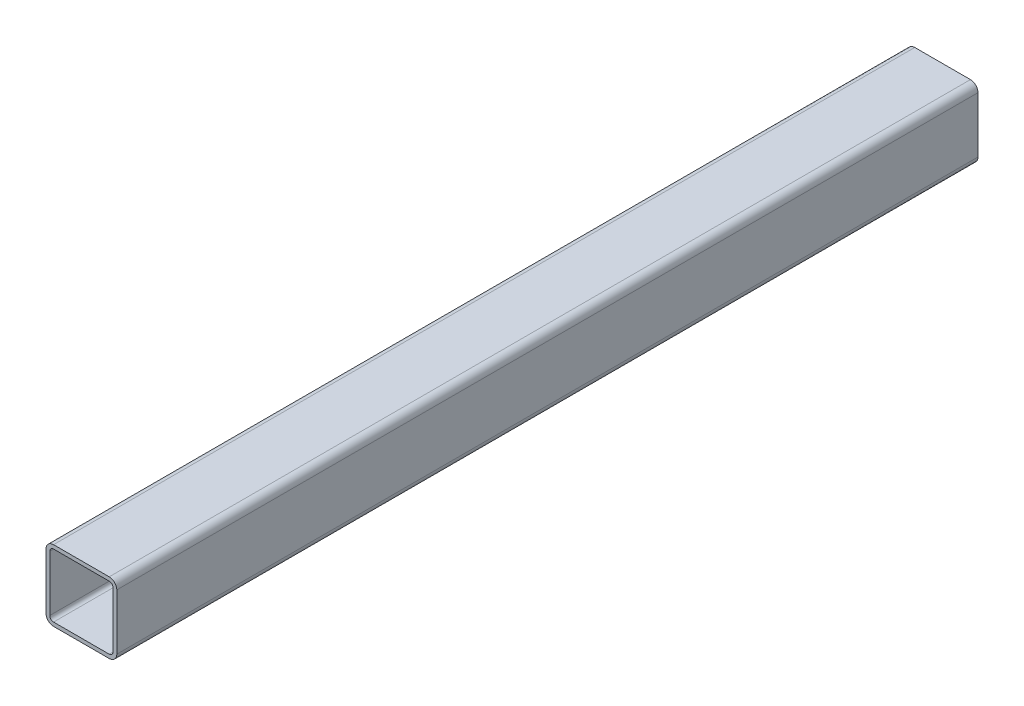
ISO-10303-21;
HEADER;
FILE_DESCRIPTION(('STEP AP214'),'2;1');
FILE_NAME('part.step','',(''),(''),'','','');
FILE_SCHEMA(('AUTOMOTIVE_DESIGN { 1 0 10303 214 1 1 1 1 }'));
ENDSEC;
DATA;
#1=APPLICATION_CONTEXT('core data for automotive mechanical design processes');
#2=APPLICATION_PROTOCOL_DEFINITION('international standard','automotive_design',2000,#1);
#3=PRODUCT_CONTEXT('',#1,'mechanical');
#4=PRODUCT('Part','Part','',(#3));
#5=PRODUCT_RELATED_PRODUCT_CATEGORY('part','',(#4));
#6=PRODUCT_DEFINITION_FORMATION('','',#4);
#7=PRODUCT_DEFINITION_CONTEXT('part definition',#1,'design');
#8=PRODUCT_DEFINITION('design','',#6,#7);
#9=PRODUCT_DEFINITION_SHAPE('','',#8);
#10=(LENGTH_UNIT() NAMED_UNIT(*) SI_UNIT(.MILLI.,.METRE.));
#11=(NAMED_UNIT(*) PLANE_ANGLE_UNIT() SI_UNIT($,.RADIAN.));
#12=(NAMED_UNIT(*) SI_UNIT($,.STERADIAN.) SOLID_ANGLE_UNIT());
#13=UNCERTAINTY_MEASURE_WITH_UNIT(LENGTH_MEASURE(1.E-05),#10,'distance_accuracy_value','');
#14=(GEOMETRIC_REPRESENTATION_CONTEXT(3) GLOBAL_UNCERTAINTY_ASSIGNED_CONTEXT((#13)) GLOBAL_UNIT_ASSIGNED_CONTEXT((#10,
#11,#12)) REPRESENTATION_CONTEXT('',''));
#15=CARTESIAN_POINT('',(0.,0.,0.));
#16=DIRECTION('',(0.,0.,1.));
#17=DIRECTION('',(1.,0.,0.));
#18=AXIS2_PLACEMENT_3D('',#15,#16,#17);
#19=CARTESIAN_POINT('',(23.5999999999996,273.2,-790.));
#20=DIRECTION('',(0.,1.,0.));
#21=DIRECTION('',(0.,0.,1.));
#22=AXIS2_PLACEMENT_3D('',#19,#20,#21);
#23=PLANE('',#22);
#24=DIRECTION('',(0.,0.,1.));
#25=VECTOR('',#24,1.);
#26=CARTESIAN_POINT('',(23.5999999999996,273.2,-790.));
#27=LINE('',#26,#25);
#28=CARTESIAN_POINT('',(23.5999999999996,273.2,-30.));
#29=VERTEX_POINT('',#28);
#30=CARTESIAN_POINT('',(23.5999999999996,273.2,-760.));
#31=VERTEX_POINT('',#30);
#32=EDGE_CURVE('E190',#29,#31,#27,.F.);
#33=ORIENTED_EDGE('',*,*,#32,.T.);
#34=DIRECTION('',(1.,0.,0.));
#35=VECTOR('',#34,1.);
#36=CARTESIAN_POINT('',(670.,273.2,-760.));
#37=LINE('',#36,#35);
#38=CARTESIAN_POINT('',(-23.6000000000003,273.2,-760.));
#39=VERTEX_POINT('',#38);
#40=EDGE_CURVE('E217',#39,#31,#37,.T.);
#41=ORIENTED_EDGE('',*,*,#40,.F.);
#42=DIRECTION('',(0.,0.,1.));
#43=VECTOR('',#42,1.);
#44=CARTESIAN_POINT('',(-23.6000000000003,273.2,-790.));
#45=LINE('',#44,#43);
#46=CARTESIAN_POINT('',(-23.6000000000003,273.2,-30.));
#47=VERTEX_POINT('',#46);
#48=EDGE_CURVE('E140',#39,#47,#45,.T.);
#49=ORIENTED_EDGE('',*,*,#48,.T.);
#50=DIRECTION('',(1.,0.,0.));
#51=VECTOR('',#50,1.);
#52=CARTESIAN_POINT('',(670.,273.2,-30.));
#53=LINE('',#52,#51);
#54=EDGE_CURVE('E154',#29,#47,#53,.F.);
#55=ORIENTED_EDGE('',*,*,#54,.F.);
#56=EDGE_LOOP('',(#33,#41,#49,#55));
#57=FACE_BOUND('',#56,.T.);
#58=ADVANCED_FACE('F17',(#57),#23,.T.);
#59=CARTESIAN_POINT('',(23.5999999999996,276.4,-790.));
#60=DIRECTION('',(0.,0.,1.));
#61=DIRECTION('',(0.,-1.,0.));
#62=AXIS2_PLACEMENT_3D('',#59,#60,#61);
#63=CYLINDRICAL_SURFACE('',#62,3.19999999999998);
#64=CARTESIAN_POINT('',(23.5999999999996,276.4,-30.));
#65=DIRECTION('',(0.,0.,1.));
#66=DIRECTION('',(0.,-1.,0.));
#67=AXIS2_PLACEMENT_3D('',#64,#65,#66);
#68=CIRCLE('',#67,3.19999999999998);
#69=CARTESIAN_POINT('',(26.7999999999997,276.4,-30.));
#70=VERTEX_POINT('',#69);
#71=EDGE_CURVE('E156',#70,#29,#68,.F.);
#72=ORIENTED_EDGE('',*,*,#71,.F.);
#73=DIRECTION('',(0.,0.,1.));
#74=VECTOR('',#73,1.);
#75=CARTESIAN_POINT('',(26.7999999999997,276.4,-790.));
#76=LINE('',#75,#74);
#77=CARTESIAN_POINT('',(26.7999999999997,276.4,-760.));
#78=VERTEX_POINT('',#77);
#79=EDGE_CURVE('E188',#78,#70,#76,.T.);
#80=ORIENTED_EDGE('',*,*,#79,.F.);
#81=CARTESIAN_POINT('',(23.5999999999996,276.4,-760.));
#82=DIRECTION('',(0.,0.,1.));
#83=DIRECTION('',(0.,-1.,0.));
#84=AXIS2_PLACEMENT_3D('',#81,#82,#83);
#85=CIRCLE('',#84,3.19999999999998);
#86=EDGE_CURVE('E214',#31,#78,#85,.T.);
#87=ORIENTED_EDGE('',*,*,#86,.F.);
#88=ORIENTED_EDGE('',*,*,#32,.F.);
#89=EDGE_LOOP('',(#72,#80,#87,#88));
#90=FACE_BOUND('',#89,.T.);
#91=ADVANCED_FACE('F242',(#90),#63,.F.);
#92=CARTESIAN_POINT('',(26.7999999999997,276.4,-790.));
#93=DIRECTION('',(-1.,0.,0.));
#94=DIRECTION('',(0.,0.,1.));
#95=AXIS2_PLACEMENT_3D('',#92,#93,#94);
#96=PLANE('',#95);
#97=DIRECTION('',(0.,0.,1.));
#98=VECTOR('',#97,1.);
#99=CARTESIAN_POINT('',(26.7999999999996,323.6,-790.));
#100=LINE('',#99,#98);
#101=CARTESIAN_POINT('',(26.7999999999996,323.6,-30.));
#102=VERTEX_POINT('',#101);
#103=CARTESIAN_POINT('',(26.7999999999997,323.6,-760.));
#104=VERTEX_POINT('',#103);
#105=EDGE_CURVE('E186',#102,#104,#100,.F.);
#106=ORIENTED_EDGE('',*,*,#105,.T.);
#107=DIRECTION('',(0.,1.,0.));
#108=VECTOR('',#107,1.);
#109=CARTESIAN_POINT('',(26.7999999999997,276.4,-760.));
#110=LINE('',#109,#108);
#111=EDGE_CURVE('E213',#78,#104,#110,.T.);
#112=ORIENTED_EDGE('',*,*,#111,.F.);
#113=ORIENTED_EDGE('',*,*,#79,.T.);
#114=DIRECTION('',(0.,-1.,0.));
#115=VECTOR('',#114,1.);
#116=CARTESIAN_POINT('',(26.7999999999996,323.6,-30.));
#117=LINE('',#116,#115);
#118=EDGE_CURVE('E157',#102,#70,#117,.T.);
#119=ORIENTED_EDGE('',*,*,#118,.F.);
#120=EDGE_LOOP('',(#106,#112,#113,#119));
#121=FACE_BOUND('',#120,.T.);
#122=ADVANCED_FACE('F238',(#121),#96,.T.);
#123=CARTESIAN_POINT('',(23.5999999999996,323.6,-790.));
#124=DIRECTION('',(0.,0.,1.));
#125=DIRECTION('',(0.,-1.,0.));
#126=AXIS2_PLACEMENT_3D('',#123,#124,#125);
#127=CYLINDRICAL_SURFACE('',#126,3.19999999999998);
#128=CARTESIAN_POINT('',(23.5999999999996,323.6,-30.));
#129=DIRECTION('',(0.,0.,1.));
#130=DIRECTION('',(0.,-1.,0.));
#131=AXIS2_PLACEMENT_3D('',#128,#129,#130);
#132=CIRCLE('',#131,3.19999999999998);
#133=CARTESIAN_POINT('',(23.5999999999996,326.8,-30.));
#134=VERTEX_POINT('',#133);
#135=EDGE_CURVE('E160',#134,#102,#132,.F.);
#136=ORIENTED_EDGE('',*,*,#135,.F.);
#137=DIRECTION('',(0.,0.,-1.));
#138=VECTOR('',#137,1.);
#139=CARTESIAN_POINT('',(23.5999999999996,326.8,-790.));
#140=LINE('',#139,#138);
#141=CARTESIAN_POINT('',(23.5999999999996,326.8,-760.));
#142=VERTEX_POINT('',#141);
#143=EDGE_CURVE('E182',#142,#134,#140,.F.);
#144=ORIENTED_EDGE('',*,*,#143,.F.);
#145=CARTESIAN_POINT('',(23.5999999999996,323.6,-760.));
#146=DIRECTION('',(0.,0.,1.));
#147=DIRECTION('',(0.,-1.,0.));
#148=AXIS2_PLACEMENT_3D('',#145,#146,#147);
#149=CIRCLE('',#148,3.19999999999998);
#150=EDGE_CURVE('E210',#104,#142,#149,.T.);
#151=ORIENTED_EDGE('',*,*,#150,.F.);
#152=ORIENTED_EDGE('',*,*,#105,.F.);
#153=EDGE_LOOP('',(#136,#144,#151,#152));
#154=FACE_BOUND('',#153,.T.);
#155=ADVANCED_FACE('F232',(#154),#127,.F.);
#156=CARTESIAN_POINT('',(-23.6000000000003,326.8,-790.));
#157=DIRECTION('',(0.,-1.,0.));
#158=DIRECTION('',(0.,0.,-1.));
#159=AXIS2_PLACEMENT_3D('',#156,#157,#158);
#160=PLANE('',#159);
#161=DIRECTION('',(0.,0.,1.));
#162=VECTOR('',#161,1.);
#163=CARTESIAN_POINT('',(-23.6000000000003,326.8,-790.));
#164=LINE('',#163,#162);
#165=CARTESIAN_POINT('',(-23.6000000000003,326.8,-30.));
#166=VERTEX_POINT('',#165);
#167=CARTESIAN_POINT('',(-23.6000000000003,326.8,-760.));
#168=VERTEX_POINT('',#167);
#169=EDGE_CURVE('E115',#166,#168,#164,.F.);
#170=ORIENTED_EDGE('',*,*,#169,.T.);
#171=DIRECTION('',(1.,0.,0.));
#172=VECTOR('',#171,1.);
#173=CARTESIAN_POINT('',(670.,326.8,-760.));
#174=LINE('',#173,#172);
#175=EDGE_CURVE('E209',#142,#168,#174,.F.);
#176=ORIENTED_EDGE('',*,*,#175,.F.);
#177=ORIENTED_EDGE('',*,*,#143,.T.);
#178=DIRECTION('',(1.,0.,0.));
#179=VECTOR('',#178,1.);
#180=CARTESIAN_POINT('',(670.,326.8,-30.));
#181=LINE('',#180,#179);
#182=EDGE_CURVE('E119',#166,#134,#181,.T.);
#183=ORIENTED_EDGE('',*,*,#182,.F.);
#184=EDGE_LOOP('',(#170,#176,#177,#183));
#185=FACE_BOUND('',#184,.T.);
#186=ADVANCED_FACE('F413',(#185),#160,.T.);
#187=CARTESIAN_POINT('',(-23.6000000000003,276.4,-790.));
#188=DIRECTION('',(0.,0.,1.));
#189=DIRECTION('',(0.,-1.,0.));
#190=AXIS2_PLACEMENT_3D('',#187,#188,#189);
#191=CYLINDRICAL_SURFACE('',#190,6.40000000000002);
#192=CARTESIAN_POINT('',(-23.6000000000003,276.4,-760.));
#193=DIRECTION('',(0.,0.,1.));
#194=DIRECTION('',(0.,-1.,0.));
#195=AXIS2_PLACEMENT_3D('',#192,#193,#194);
#196=CIRCLE('',#195,6.40000000000002);
#197=CARTESIAN_POINT('',(-23.6000000000003,270.,-760.));
#198=VERTEX_POINT('',#197);
#199=CARTESIAN_POINT('',(-30.0000000000004,276.4,-760.));
#200=VERTEX_POINT('',#199);
#201=EDGE_CURVE('E203',#198,#200,#196,.F.);
#202=ORIENTED_EDGE('',*,*,#201,.F.);
#203=DIRECTION('',(0.,0.,1.));
#204=VECTOR('',#203,1.);
#205=CARTESIAN_POINT('',(-23.6000000000003,270.,-790.));
#206=LINE('',#205,#204);
#207=CARTESIAN_POINT('',(-23.6000000000003,270.,-30.));
#208=VERTEX_POINT('',#207);
#209=EDGE_CURVE('E165',#198,#208,#206,.T.);
#210=ORIENTED_EDGE('',*,*,#209,.T.);
#211=CARTESIAN_POINT('',(-23.6000000000003,276.4,-30.));
#212=DIRECTION('',(0.,0.,1.));
#213=DIRECTION('',(0.,-1.,0.));
#214=AXIS2_PLACEMENT_3D('',#211,#212,#213);
#215=CIRCLE('',#214,6.40000000000002);
#216=CARTESIAN_POINT('',(-30.0000000000004,276.4,-30.));
#217=VERTEX_POINT('',#216);
#218=EDGE_CURVE('E153',#217,#208,#215,.T.);
#219=ORIENTED_EDGE('',*,*,#218,.F.);
#220=DIRECTION('',(0.,0.,-1.));
#221=VECTOR('',#220,1.);
#222=CARTESIAN_POINT('',(-30.0000000000004,276.4,-790.));
#223=LINE('',#222,#221);
#224=EDGE_CURVE('E179',#217,#200,#223,.T.);
#225=ORIENTED_EDGE('',*,*,#224,.T.);
#226=EDGE_LOOP('',(#202,#210,#219,#225));
#227=FACE_BOUND('',#226,.T.);
#228=ADVANCED_FACE('F287',(#227),#191,.T.);
#229=CARTESIAN_POINT('',(-30.0000000000004,323.6,-790.));
#230=DIRECTION('',(1.,0.,0.));
#231=DIRECTION('',(0.,0.,-1.));
#232=AXIS2_PLACEMENT_3D('',#229,#230,#231);
#233=PLANE('',#232);
#234=DIRECTION('',(0.,0.,1.));
#235=VECTOR('',#234,1.);
#236=CARTESIAN_POINT('',(-30.0000000000003,323.6,-790.));
#237=LINE('',#236,#235);
#238=CARTESIAN_POINT('',(-30.0000000000003,323.6,-760.));
#239=VERTEX_POINT('',#238);
#240=CARTESIAN_POINT('',(-30.0000000000003,323.6,-30.));
#241=VERTEX_POINT('',#240);
#242=EDGE_CURVE('E177',#239,#241,#237,.T.);
#243=ORIENTED_EDGE('',*,*,#242,.F.);
#244=DIRECTION('',(0.,1.,0.));
#245=VECTOR('',#244,1.);
#246=CARTESIAN_POINT('',(-30.0000000000004,276.4,-760.));
#247=LINE('',#246,#245);
#248=EDGE_CURVE('E202',#200,#239,#247,.T.);
#249=ORIENTED_EDGE('',*,*,#248,.F.);
#250=ORIENTED_EDGE('',*,*,#224,.F.);
#251=DIRECTION('',(0.,-1.,0.));
#252=VECTOR('',#251,1.);
#253=CARTESIAN_POINT('',(-30.0000000000004,323.6,-30.));
#254=LINE('',#253,#252);
#255=EDGE_CURVE('E137',#241,#217,#254,.T.);
#256=ORIENTED_EDGE('',*,*,#255,.F.);
#257=EDGE_LOOP('',(#243,#249,#250,#256));
#258=FACE_BOUND('',#257,.T.);
#259=ADVANCED_FACE('F290',(#258),#233,.F.);
#260=CARTESIAN_POINT('',(-23.6000000000003,323.6,-790.));
#261=DIRECTION('',(0.,0.,1.));
#262=DIRECTION('',(0.,-1.,0.));
#263=AXIS2_PLACEMENT_3D('',#260,#261,#262);
#264=CYLINDRICAL_SURFACE('',#263,6.40000000000002);
#265=CARTESIAN_POINT('',(-23.6000000000003,323.6,-760.));
#266=DIRECTION('',(0.,0.,1.));
#267=DIRECTION('',(0.,-1.,0.));
#268=AXIS2_PLACEMENT_3D('',#265,#266,#267);
#269=CIRCLE('',#268,6.40000000000002);
#270=CARTESIAN_POINT('',(-23.6000000000003,330.,-760.));
#271=VERTEX_POINT('',#270);
#272=EDGE_CURVE('E199',#239,#271,#269,.F.);
#273=ORIENTED_EDGE('',*,*,#272,.F.);
#274=ORIENTED_EDGE('',*,*,#242,.T.);
#275=CARTESIAN_POINT('',(-23.6000000000003,323.6,-30.));
#276=DIRECTION('',(0.,0.,1.));
#277=DIRECTION('',(0.,-1.,0.));
#278=AXIS2_PLACEMENT_3D('',#275,#276,#277);
#279=CIRCLE('',#278,6.40000000000002);
#280=CARTESIAN_POINT('',(-23.6000000000003,330.,-30.));
#281=VERTEX_POINT('',#280);
#282=EDGE_CURVE('E141',#281,#241,#279,.T.);
#283=ORIENTED_EDGE('',*,*,#282,.F.);
#284=DIRECTION('',(0.,0.,-1.));
#285=VECTOR('',#284,1.);
#286=CARTESIAN_POINT('',(-23.6000000000003,330.,-790.));
#287=LINE('',#286,#285);
#288=EDGE_CURVE('E174',#281,#271,#287,.T.);
#289=ORIENTED_EDGE('',*,*,#288,.T.);
#290=EDGE_LOOP('',(#273,#274,#283,#289));
#291=FACE_BOUND('',#290,.T.);
#292=ADVANCED_FACE('F303',(#291),#264,.T.);
#293=CARTESIAN_POINT('',(-23.6000000000003,330.,-790.));
#294=DIRECTION('',(0.,-1.,0.));
#295=DIRECTION('',(0.,0.,-1.));
#296=AXIS2_PLACEMENT_3D('',#293,#294,#295);
#297=PLANE('',#296);
#298=DIRECTION('',(0.,0.,1.));
#299=VECTOR('',#298,1.);
#300=CARTESIAN_POINT('',(23.5999999999996,330.,-790.));
#301=LINE('',#300,#299);
#302=CARTESIAN_POINT('',(23.5999999999996,330.,-760.));
#303=VERTEX_POINT('',#302);
#304=CARTESIAN_POINT('',(23.5999999999996,330.,-30.));
#305=VERTEX_POINT('',#304);
#306=EDGE_CURVE('E172',#303,#305,#301,.T.);
#307=ORIENTED_EDGE('',*,*,#306,.F.);
#308=DIRECTION('',(1.,0.,0.));
#309=VECTOR('',#308,1.);
#310=CARTESIAN_POINT('',(670.,330.,-760.));
#311=LINE('',#310,#309);
#312=EDGE_CURVE('E198',#271,#303,#311,.T.);
#313=ORIENTED_EDGE('',*,*,#312,.F.);
#314=ORIENTED_EDGE('',*,*,#288,.F.);
#315=DIRECTION('',(1.,0.,0.));
#316=VECTOR('',#315,1.);
#317=CARTESIAN_POINT('',(670.,330.,-30.));
#318=LINE('',#317,#316);
#319=EDGE_CURVE('E142',#305,#281,#318,.F.);
#320=ORIENTED_EDGE('',*,*,#319,.F.);
#321=EDGE_LOOP('',(#307,#313,#314,#320));
#322=FACE_BOUND('',#321,.T.);
#323=ADVANCED_FACE('F306',(#322),#297,.F.);
#324=CARTESIAN_POINT('',(23.5999999999996,323.6,-790.));
#325=DIRECTION('',(0.,0.,1.));
#326=DIRECTION('',(0.,-1.,0.));
#327=AXIS2_PLACEMENT_3D('',#324,#325,#326);
#328=CYLINDRICAL_SURFACE('',#327,6.40000000000002);
#329=CARTESIAN_POINT('',(23.5999999999996,323.6,-760.));
#330=DIRECTION('',(0.,0.,1.));
#331=DIRECTION('',(0.,-1.,0.));
#332=AXIS2_PLACEMENT_3D('',#329,#330,#331);
#333=CIRCLE('',#332,6.40000000000002);
#334=CARTESIAN_POINT('',(29.9999999999997,323.6,-760.));
#335=VERTEX_POINT('',#334);
#336=EDGE_CURVE('E195',#303,#335,#333,.F.);
#337=ORIENTED_EDGE('',*,*,#336,.F.);
#338=ORIENTED_EDGE('',*,*,#306,.T.);
#339=CARTESIAN_POINT('',(23.5999999999996,323.6,-30.));
#340=DIRECTION('',(0.,0.,1.));
#341=DIRECTION('',(0.,-1.,0.));
#342=AXIS2_PLACEMENT_3D('',#339,#340,#341);
#343=CIRCLE('',#342,6.40000000000002);
#344=CARTESIAN_POINT('',(29.9999999999997,323.6,-30.));
#345=VERTEX_POINT('',#344);
#346=EDGE_CURVE('E145',#345,#305,#343,.T.);
#347=ORIENTED_EDGE('',*,*,#346,.F.);
#348=DIRECTION('',(0.,0.,1.));
#349=VECTOR('',#348,1.);
#350=CARTESIAN_POINT('',(29.9999999999997,323.6,-790.));
#351=LINE('',#350,#349);
#352=EDGE_CURVE('E169',#345,#335,#351,.F.);
#353=ORIENTED_EDGE('',*,*,#352,.T.);
#354=EDGE_LOOP('',(#337,#338,#347,#353));
#355=FACE_BOUND('',#354,.T.);
#356=ADVANCED_FACE('F307',(#355),#328,.T.);
#357=CARTESIAN_POINT('',(29.9999999999997,276.4,-790.));
#358=DIRECTION('',(-1.,0.,0.));
#359=DIRECTION('',(0.,0.,1.));
#360=AXIS2_PLACEMENT_3D('',#357,#358,#359);
#361=PLANE('',#360);
#362=DIRECTION('',(0.,0.,1.));
#363=VECTOR('',#362,1.);
#364=CARTESIAN_POINT('',(29.9999999999996,276.4,-790.));
#365=LINE('',#364,#363);
#366=CARTESIAN_POINT('',(29.9999999999997,276.4,-760.));
#367=VERTEX_POINT('',#366);
#368=CARTESIAN_POINT('',(29.9999999999997,276.4,-30.0000000000001));
#369=VERTEX_POINT('',#368);
#370=EDGE_CURVE('E166',#367,#369,#365,.T.);
#371=ORIENTED_EDGE('',*,*,#370,.F.);
#372=DIRECTION('',(0.,1.,0.));
#373=VECTOR('',#372,1.);
#374=CARTESIAN_POINT('',(29.9999999999997,276.4,-760.));
#375=LINE('',#374,#373);
#376=EDGE_CURVE('E194',#335,#367,#375,.F.);
#377=ORIENTED_EDGE('',*,*,#376,.F.);
#378=ORIENTED_EDGE('',*,*,#352,.F.);
#379=DIRECTION('',(0.,-1.,0.));
#380=VECTOR('',#379,1.);
#381=CARTESIAN_POINT('',(29.9999999999997,323.6,-30.));
#382=LINE('',#381,#380);
#383=EDGE_CURVE('E146',#369,#345,#382,.F.);
#384=ORIENTED_EDGE('',*,*,#383,.F.);
#385=EDGE_LOOP('',(#371,#377,#378,#384));
#386=FACE_BOUND('',#385,.T.);
#387=ADVANCED_FACE('F268',(#386),#361,.F.);
#388=CARTESIAN_POINT('',(23.5999999999996,276.4,-790.));
#389=DIRECTION('',(0.,0.,1.));
#390=DIRECTION('',(0.,-1.,0.));
#391=AXIS2_PLACEMENT_3D('',#388,#389,#390);
#392=CYLINDRICAL_SURFACE('',#391,6.40000000000002);
#393=CARTESIAN_POINT('',(23.5999999999996,276.4,-760.));
#394=DIRECTION('',(0.,0.,1.));
#395=DIRECTION('',(0.,-1.,0.));
#396=AXIS2_PLACEMENT_3D('',#393,#394,#395);
#397=CIRCLE('',#396,6.40000000000002);
#398=CARTESIAN_POINT('',(23.5999999999996,270.,-760.));
#399=VERTEX_POINT('',#398);
#400=EDGE_CURVE('E133',#367,#399,#397,.F.);
#401=ORIENTED_EDGE('',*,*,#400,.F.);
#402=ORIENTED_EDGE('',*,*,#370,.T.);
#403=CARTESIAN_POINT('',(23.5999999999996,276.4,-30.0000000000002));
#404=DIRECTION('',(0.,0.,1.));
#405=DIRECTION('',(0.,-1.,0.));
#406=AXIS2_PLACEMENT_3D('',#403,#404,#405);
#407=CIRCLE('',#406,6.40000000000002);
#408=CARTESIAN_POINT('',(23.5999999999996,270.,-30.0000000000001));
#409=VERTEX_POINT('',#408);
#410=EDGE_CURVE('E149',#409,#369,#407,.T.);
#411=ORIENTED_EDGE('',*,*,#410,.F.);
#412=DIRECTION('',(0.,0.,1.));
#413=VECTOR('',#412,1.);
#414=CARTESIAN_POINT('',(23.5999999999996,270.,-790.));
#415=LINE('',#414,#413);
#416=EDGE_CURVE('E162',#409,#399,#415,.F.);
#417=ORIENTED_EDGE('',*,*,#416,.T.);
#418=EDGE_LOOP('',(#401,#402,#411,#417));
#419=FACE_BOUND('',#418,.T.);
#420=ADVANCED_FACE('F298',(#419),#392,.T.);
#421=CARTESIAN_POINT('',(23.5999999999996,270.,-790.));
#422=DIRECTION('',(0.,1.,0.));
#423=DIRECTION('',(0.,0.,1.));
#424=AXIS2_PLACEMENT_3D('',#421,#422,#423);
#425=PLANE('',#424);
#426=ORIENTED_EDGE('',*,*,#209,.F.);
#427=DIRECTION('',(1.,0.,0.));
#428=VECTOR('',#427,1.);
#429=CARTESIAN_POINT('',(670.,270.,-760.));
#430=LINE('',#429,#428);
#431=EDGE_CURVE('E130',#399,#198,#430,.F.);
#432=ORIENTED_EDGE('',*,*,#431,.F.);
#433=ORIENTED_EDGE('',*,*,#416,.F.);
#434=DIRECTION('',(1.,0.,0.));
#435=VECTOR('',#434,1.);
#436=CARTESIAN_POINT('',(670.,270.,-30.));
#437=LINE('',#436,#435);
#438=EDGE_CURVE('E150',#208,#409,#437,.T.);
#439=ORIENTED_EDGE('',*,*,#438,.F.);
#440=EDGE_LOOP('',(#426,#432,#433,#439));
#441=FACE_BOUND('',#440,.T.);
#442=ADVANCED_FACE('F294',(#441),#425,.F.);
#443=CARTESIAN_POINT('',(-23.6000000000003,323.6,-790.));
#444=DIRECTION('',(0.,0.,1.));
#445=DIRECTION('',(0.,-1.,0.));
#446=AXIS2_PLACEMENT_3D('',#443,#444,#445);
#447=CYLINDRICAL_SURFACE('',#446,3.19999999999993);
#448=CARTESIAN_POINT('',(-23.6000000000003,323.6,-30.));
#449=DIRECTION('',(0.,0.,1.));
#450=DIRECTION('',(0.,-1.,0.));
#451=AXIS2_PLACEMENT_3D('',#448,#449,#450);
#452=CIRCLE('',#451,3.19999999999993);
#453=CARTESIAN_POINT('',(-26.8000000000003,323.6,-30.));
#454=VERTEX_POINT('',#453);
#455=EDGE_CURVE('E20',#454,#166,#452,.F.);
#456=ORIENTED_EDGE('',*,*,#455,.F.);
#457=DIRECTION('',(0.,0.,1.));
#458=VECTOR('',#457,1.);
#459=CARTESIAN_POINT('',(-26.8000000000003,323.6,-790.));
#460=LINE('',#459,#458);
#461=CARTESIAN_POINT('',(-26.8000000000003,323.6,-760.));
#462=VERTEX_POINT('',#461);
#463=EDGE_CURVE('E113',#462,#454,#460,.T.);
#464=ORIENTED_EDGE('',*,*,#463,.F.);
#465=CARTESIAN_POINT('',(-23.6000000000003,323.6,-760.));
#466=DIRECTION('',(0.,0.,1.));
#467=DIRECTION('',(0.,-1.,0.));
#468=AXIS2_PLACEMENT_3D('',#465,#466,#467);
#469=CIRCLE('',#468,3.19999999999993);
#470=EDGE_CURVE('E207',#168,#462,#469,.T.);
#471=ORIENTED_EDGE('',*,*,#470,.F.);
#472=ORIENTED_EDGE('',*,*,#169,.F.);
#473=EDGE_LOOP('',(#456,#464,#471,#472));
#474=FACE_BOUND('',#473,.T.);
#475=ADVANCED_FACE('F110',(#474),#447,.F.);
#476=CARTESIAN_POINT('',(670.,323.6,-30.));
#477=DIRECTION('',(0.,0.,1.));
#478=DIRECTION('',(0.,-1.,0.));
#479=AXIS2_PLACEMENT_3D('',#476,#477,#478);
#480=PLANE('',#479);
#481=ORIENTED_EDGE('',*,*,#282,.T.);
#482=ORIENTED_EDGE('',*,*,#255,.T.);
#483=ORIENTED_EDGE('',*,*,#218,.T.);
#484=ORIENTED_EDGE('',*,*,#438,.T.);
#485=ORIENTED_EDGE('',*,*,#410,.T.);
#486=ORIENTED_EDGE('',*,*,#383,.T.);
#487=ORIENTED_EDGE('',*,*,#346,.T.);
#488=ORIENTED_EDGE('',*,*,#319,.T.);
#489=EDGE_LOOP('',(#481,#482,#483,#484,#485,#486,#487,#488));
#490=FACE_BOUND('',#489,.T.);
#491=ORIENTED_EDGE('',*,*,#54,.T.);
#492=CARTESIAN_POINT('',(-23.6000000000003,276.4,-30.));
#493=DIRECTION('',(0.,0.,1.));
#494=DIRECTION('',(0.,-1.,0.));
#495=AXIS2_PLACEMENT_3D('',#492,#493,#494);
#496=CIRCLE('',#495,3.19999999999998);
#497=CARTESIAN_POINT('',(-26.8000000000004,276.4,-30.));
#498=VERTEX_POINT('',#497);
#499=EDGE_CURVE('E125',#47,#498,#496,.F.);
#500=ORIENTED_EDGE('',*,*,#499,.T.);
#501=DIRECTION('',(0.,1.,0.));
#502=VECTOR('',#501,1.);
#503=CARTESIAN_POINT('',(-26.8000000000003,323.6,-30.));
#504=LINE('',#503,#502);
#505=EDGE_CURVE('E121',#454,#498,#504,.F.);
#506=ORIENTED_EDGE('',*,*,#505,.F.);
#507=ORIENTED_EDGE('',*,*,#455,.T.);
#508=ORIENTED_EDGE('',*,*,#182,.T.);
#509=ORIENTED_EDGE('',*,*,#135,.T.);
#510=ORIENTED_EDGE('',*,*,#118,.T.);
#511=ORIENTED_EDGE('',*,*,#71,.T.);
#512=EDGE_LOOP('',(#491,#500,#506,#507,#508,#509,#510,#511));
#513=FACE_BOUND('',#512,.T.);
#514=ADVANCED_FACE('F123',(#490,#513),#480,.T.);
#515=CARTESIAN_POINT('',(-23.6000000000003,276.4,-790.));
#516=DIRECTION('',(0.,0.,1.));
#517=DIRECTION('',(0.,-1.,0.));
#518=AXIS2_PLACEMENT_3D('',#515,#516,#517);
#519=CYLINDRICAL_SURFACE('',#518,3.19999999999998);
#520=ORIENTED_EDGE('',*,*,#499,.F.);
#521=ORIENTED_EDGE('',*,*,#48,.F.);
#522=CARTESIAN_POINT('',(-23.6000000000003,276.4,-760.));
#523=DIRECTION('',(0.,0.,1.));
#524=DIRECTION('',(0.,-1.,0.));
#525=AXIS2_PLACEMENT_3D('',#522,#523,#524);
#526=CIRCLE('',#525,3.19999999999998);
#527=CARTESIAN_POINT('',(-26.8000000000004,276.4,-760.));
#528=VERTEX_POINT('',#527);
#529=EDGE_CURVE('E35',#528,#39,#526,.T.);
#530=ORIENTED_EDGE('',*,*,#529,.F.);
#531=DIRECTION('',(0.,0.,1.));
#532=VECTOR('',#531,1.);
#533=CARTESIAN_POINT('',(-26.8000000000004,276.4,-790.));
#534=LINE('',#533,#532);
#535=EDGE_CURVE('E26',#498,#528,#534,.F.);
#536=ORIENTED_EDGE('',*,*,#535,.F.);
#537=EDGE_LOOP('',(#520,#521,#530,#536));
#538=FACE_BOUND('',#537,.T.);
#539=ADVANCED_FACE('F245',(#538),#519,.F.);
#540=CARTESIAN_POINT('',(670.,276.4,-760.));
#541=DIRECTION('',(0.,0.,-1.));
#542=DIRECTION('',(0.,1.,0.));
#543=AXIS2_PLACEMENT_3D('',#540,#541,#542);
#544=PLANE('',#543);
#545=ORIENTED_EDGE('',*,*,#400,.T.);
#546=ORIENTED_EDGE('',*,*,#431,.T.);
#547=ORIENTED_EDGE('',*,*,#201,.T.);
#548=ORIENTED_EDGE('',*,*,#248,.T.);
#549=ORIENTED_EDGE('',*,*,#272,.T.);
#550=ORIENTED_EDGE('',*,*,#312,.T.);
#551=ORIENTED_EDGE('',*,*,#336,.T.);
#552=ORIENTED_EDGE('',*,*,#376,.T.);
#553=EDGE_LOOP('',(#545,#546,#547,#548,#549,#550,#551,#552));
#554=FACE_BOUND('',#553,.T.);
#555=DIRECTION('',(0.,1.,0.));
#556=VECTOR('',#555,1.);
#557=CARTESIAN_POINT('',(-26.8000000000003,323.6,-760.));
#558=LINE('',#557,#556);
#559=EDGE_CURVE('E11',#528,#462,#558,.T.);
#560=ORIENTED_EDGE('',*,*,#559,.F.);
#561=ORIENTED_EDGE('',*,*,#529,.T.);
#562=ORIENTED_EDGE('',*,*,#40,.T.);
#563=ORIENTED_EDGE('',*,*,#86,.T.);
#564=ORIENTED_EDGE('',*,*,#111,.T.);
#565=ORIENTED_EDGE('',*,*,#150,.T.);
#566=ORIENTED_EDGE('',*,*,#175,.T.);
#567=ORIENTED_EDGE('',*,*,#470,.T.);
#568=EDGE_LOOP('',(#560,#561,#562,#563,#564,#565,#566,#567));
#569=FACE_BOUND('',#568,.T.);
#570=ADVANCED_FACE('F260',(#554,#569),#544,.T.);
#571=CARTESIAN_POINT('',(-26.8000000000003,323.6,-790.));
#572=DIRECTION('',(1.,0.,0.));
#573=DIRECTION('',(0.,1.,0.));
#574=AXIS2_PLACEMENT_3D('',#571,#572,#573);
#575=PLANE('',#574);
#576=ORIENTED_EDGE('',*,*,#535,.T.);
#577=ORIENTED_EDGE('',*,*,#559,.T.);
#578=ORIENTED_EDGE('',*,*,#463,.T.);
#579=ORIENTED_EDGE('',*,*,#505,.T.);
#580=EDGE_LOOP('',(#576,#577,#578,#579));
#581=FACE_BOUND('',#580,.T.);
#582=ADVANCED_FACE('F129',(#581),#575,.T.);
#583=CLOSED_SHELL('',(#58,#91,#122,#155,#186,#228,#259,#292,#323,#356,#387,#420,#442,#475,#514,
#539,#570,#582));
#584=MANIFOLD_SOLID_BREP('B1',#583);
#585=ADVANCED_BREP_SHAPE_REPRESENTATION('',(#18,#584),#14);
#586=SHAPE_DEFINITION_REPRESENTATION(#9,#585);
ENDSEC;
END-ISO-10303-21;
